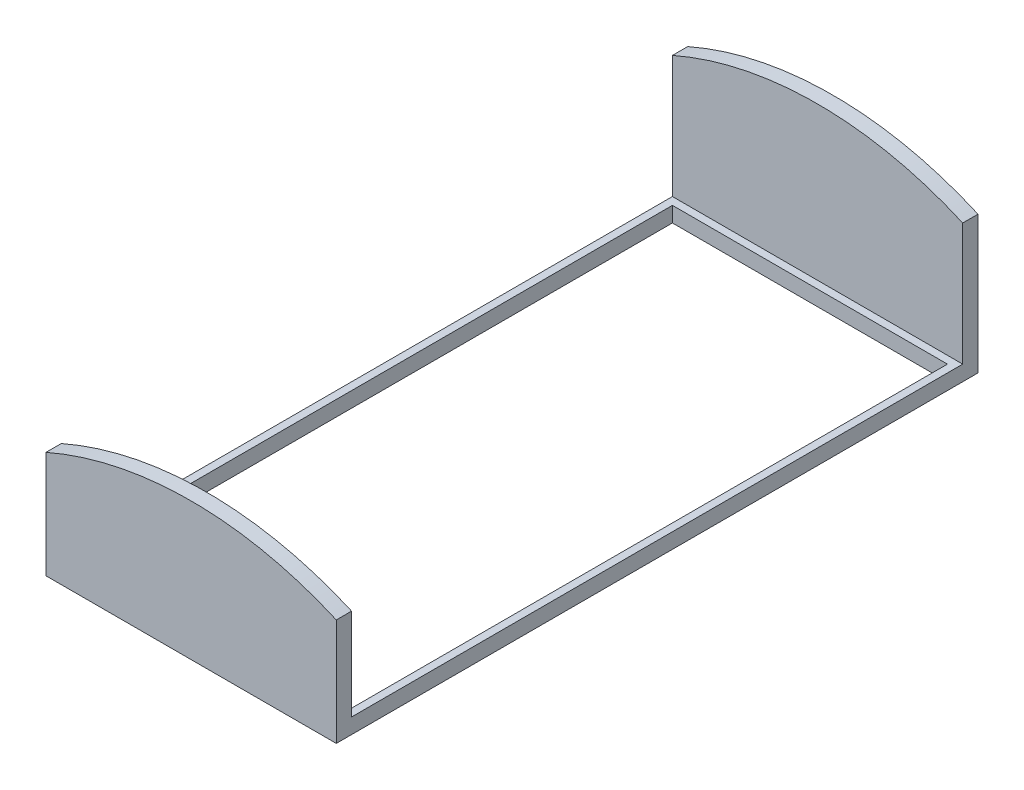
ISO-10303-21;
HEADER;
FILE_DESCRIPTION(('STEP AP214'),'2;1');
FILE_NAME('part.step','',(''),(''),'','','');
FILE_SCHEMA(('AUTOMOTIVE_DESIGN { 1 0 10303 214 1 1 1 1 }'));
ENDSEC;
DATA;
#1=APPLICATION_CONTEXT('core data for automotive mechanical design processes');
#2=APPLICATION_PROTOCOL_DEFINITION('international standard','automotive_design',2000,#1);
#3=PRODUCT_CONTEXT('',#1,'mechanical');
#4=PRODUCT('Part','Part','',(#3));
#5=PRODUCT_RELATED_PRODUCT_CATEGORY('part','',(#4));
#6=PRODUCT_DEFINITION_FORMATION('','',#4);
#7=PRODUCT_DEFINITION_CONTEXT('part definition',#1,'design');
#8=PRODUCT_DEFINITION('design','',#6,#7);
#9=PRODUCT_DEFINITION_SHAPE('','',#8);
#10=(LENGTH_UNIT() NAMED_UNIT(*) SI_UNIT(.MILLI.,.METRE.));
#11=(NAMED_UNIT(*) PLANE_ANGLE_UNIT() SI_UNIT($,.RADIAN.));
#12=(NAMED_UNIT(*) SI_UNIT($,.STERADIAN.) SOLID_ANGLE_UNIT());
#13=UNCERTAINTY_MEASURE_WITH_UNIT(LENGTH_MEASURE(1.E-05),#10,'distance_accuracy_value','');
#14=(GEOMETRIC_REPRESENTATION_CONTEXT(3) GLOBAL_UNCERTAINTY_ASSIGNED_CONTEXT((#13)) GLOBAL_UNIT_ASSIGNED_CONTEXT((#10,
#11,#12)) REPRESENTATION_CONTEXT('',''));
#15=CARTESIAN_POINT('',(0.,0.,0.));
#16=DIRECTION('',(0.,0.,1.));
#17=DIRECTION('',(1.,0.,0.));
#18=AXIS2_PLACEMENT_3D('',#15,#16,#17);
#19=CARTESIAN_POINT('',(0.,50.,0.));
#20=DIRECTION('',(0.,-1.,0.));
#21=DIRECTION('',(0.,0.,-1.));
#22=AXIS2_PLACEMENT_3D('',#19,#20,#21);
#23=PLANE('',#22);
#24=DIRECTION('',(0.,0.,-1.));
#25=VECTOR('',#24,1.);
#26=CARTESIAN_POINT('',(450.,50.,975.));
#27=LINE('',#26,#25);
#28=CARTESIAN_POINT('',(450.,50.,975.));
#29=VERTEX_POINT('',#28);
#30=CARTESIAN_POINT('',(450.,50.,-975.));
#31=VERTEX_POINT('',#30);
#32=EDGE_CURVE('E189',#29,#31,#27,.T.);
#33=ORIENTED_EDGE('',*,*,#32,.F.);
#34=DIRECTION('',(1.,0.,0.));
#35=VECTOR('',#34,1.);
#36=CARTESIAN_POINT('',(-450.,50.,975.));
#37=LINE('',#36,#35);
#38=CARTESIAN_POINT('',(-450.,50.,975.));
#39=VERTEX_POINT('',#38);
#40=EDGE_CURVE('E196',#39,#29,#37,.T.);
#41=ORIENTED_EDGE('',*,*,#40,.F.);
#42=DIRECTION('',(0.,0.,1.));
#43=VECTOR('',#42,1.);
#44=CARTESIAN_POINT('',(-450.,50.,975.));
#45=LINE('',#44,#43);
#46=CARTESIAN_POINT('',(-450.,50.,-975.));
#47=VERTEX_POINT('',#46);
#48=EDGE_CURVE('E194',#47,#39,#45,.T.);
#49=ORIENTED_EDGE('',*,*,#48,.F.);
#50=DIRECTION('',(-1.,0.,0.));
#51=VECTOR('',#50,1.);
#52=CARTESIAN_POINT('',(-450.,50.,-975.));
#53=LINE('',#52,#51);
#54=EDGE_CURVE('E191',#31,#47,#53,.T.);
#55=ORIENTED_EDGE('',*,*,#54,.F.);
#56=EDGE_LOOP('',(#33,#41,#49,#55));
#57=FACE_BOUND('',#56,.T.);
#58=DIRECTION('',(-1.,0.,0.));
#59=VECTOR('',#58,1.);
#60=CARTESIAN_POINT('',(-475.,50.,1000.));
#61=LINE('',#60,#59);
#62=CARTESIAN_POINT('',(475.,50.,1000.));
#63=VERTEX_POINT('',#62);
#64=CARTESIAN_POINT('',(-475.,50.,1000.));
#65=VERTEX_POINT('',#64);
#66=EDGE_CURVE('E150',#63,#65,#61,.T.);
#67=ORIENTED_EDGE('',*,*,#66,.F.);
#68=DIRECTION('',(0.,0.,-1.));
#69=VECTOR('',#68,1.);
#70=CARTESIAN_POINT('',(475.,50.,1000.));
#71=LINE('',#70,#69);
#72=CARTESIAN_POINT('',(475.,50.,-1000.));
#73=VERTEX_POINT('',#72);
#74=EDGE_CURVE('E41',#63,#73,#71,.T.);
#75=ORIENTED_EDGE('',*,*,#74,.T.);
#76=DIRECTION('',(1.,0.,0.));
#77=VECTOR('',#76,1.);
#78=CARTESIAN_POINT('',(-475.,50.,-1000.));
#79=LINE('',#78,#77);
#80=CARTESIAN_POINT('',(-475.,50.,-1000.));
#81=VERTEX_POINT('',#80);
#82=EDGE_CURVE('E48',#81,#73,#79,.T.);
#83=ORIENTED_EDGE('',*,*,#82,.F.);
#84=DIRECTION('',(0.,0.,1.));
#85=VECTOR('',#84,1.);
#86=CARTESIAN_POINT('',(-475.,50.,1000.));
#87=LINE('',#86,#85);
#88=EDGE_CURVE('E11',#81,#65,#87,.T.);
#89=ORIENTED_EDGE('',*,*,#88,.T.);
#90=EDGE_LOOP('',(#67,#75,#83,#89));
#91=FACE_BOUND('',#90,.T.);
#92=ADVANCED_FACE('F32',(#57,#91),#23,.F.);
#93=CARTESIAN_POINT('',(0.,0.,0.));
#94=DIRECTION('',(0.,-1.,0.));
#95=DIRECTION('',(0.,0.,-1.));
#96=AXIS2_PLACEMENT_3D('',#93,#94,#95);
#97=PLANE('',#96);
#98=DIRECTION('',(0.,0.,-1.));
#99=VECTOR('',#98,1.);
#100=CARTESIAN_POINT('',(475.,0.,1000.));
#101=LINE('',#100,#99);
#102=CARTESIAN_POINT('',(475.,0.,1050.));
#103=VERTEX_POINT('',#102);
#104=CARTESIAN_POINT('',(475.,0.,-1050.));
#105=VERTEX_POINT('',#104);
#106=EDGE_CURVE('E217',#103,#105,#101,.T.);
#107=ORIENTED_EDGE('',*,*,#106,.F.);
#108=DIRECTION('',(1.,0.,0.));
#109=VECTOR('',#108,1.);
#110=CARTESIAN_POINT('',(-475.,0.,1050.));
#111=LINE('',#110,#109);
#112=CARTESIAN_POINT('',(-475.,0.,1050.));
#113=VERTEX_POINT('',#112);
#114=EDGE_CURVE('E142',#113,#103,#111,.T.);
#115=ORIENTED_EDGE('',*,*,#114,.F.);
#116=DIRECTION('',(0.,0.,1.));
#117=VECTOR('',#116,1.);
#118=CARTESIAN_POINT('',(-475.,0.,1000.));
#119=LINE('',#118,#117);
#120=CARTESIAN_POINT('',(-475.,0.,-1050.));
#121=VERTEX_POINT('',#120);
#122=EDGE_CURVE('E36',#121,#113,#119,.T.);
#123=ORIENTED_EDGE('',*,*,#122,.F.);
#124=DIRECTION('',(-1.,0.,0.));
#125=VECTOR('',#124,1.);
#126=CARTESIAN_POINT('',(475.,0.,-1050.));
#127=LINE('',#126,#125);
#128=EDGE_CURVE('E182',#105,#121,#127,.T.);
#129=ORIENTED_EDGE('',*,*,#128,.F.);
#130=EDGE_LOOP('',(#107,#115,#123,#129));
#131=FACE_BOUND('',#130,.T.);
#132=DIRECTION('',(1.,0.,0.));
#133=VECTOR('',#132,1.);
#134=CARTESIAN_POINT('',(-450.,0.,975.));
#135=LINE('',#134,#133);
#136=CARTESIAN_POINT('',(-450.,0.,975.));
#137=VERTEX_POINT('',#136);
#138=CARTESIAN_POINT('',(450.,0.,975.));
#139=VERTEX_POINT('',#138);
#140=EDGE_CURVE('E192',#137,#139,#135,.T.);
#141=ORIENTED_EDGE('',*,*,#140,.T.);
#142=DIRECTION('',(0.,0.,-1.));
#143=VECTOR('',#142,1.);
#144=CARTESIAN_POINT('',(450.,0.,975.));
#145=LINE('',#144,#143);
#146=CARTESIAN_POINT('',(450.,0.,-975.));
#147=VERTEX_POINT('',#146);
#148=EDGE_CURVE('E188',#139,#147,#145,.T.);
#149=ORIENTED_EDGE('',*,*,#148,.T.);
#150=DIRECTION('',(-1.,0.,0.));
#151=VECTOR('',#150,1.);
#152=CARTESIAN_POINT('',(-450.,0.,-975.));
#153=LINE('',#152,#151);
#154=CARTESIAN_POINT('',(-450.,0.,-975.));
#155=VERTEX_POINT('',#154);
#156=EDGE_CURVE('E201',#147,#155,#153,.T.);
#157=ORIENTED_EDGE('',*,*,#156,.T.);
#158=DIRECTION('',(0.,0.,1.));
#159=VECTOR('',#158,1.);
#160=CARTESIAN_POINT('',(-450.,0.,975.));
#161=LINE('',#160,#159);
#162=EDGE_CURVE('E204',#155,#137,#161,.T.);
#163=ORIENTED_EDGE('',*,*,#162,.T.);
#164=EDGE_LOOP('',(#141,#149,#157,#163));
#165=FACE_BOUND('',#164,.T.);
#166=ADVANCED_FACE('F223',(#131,#165),#97,.T.);
#167=CARTESIAN_POINT('',(475.,50.,1000.));
#168=DIRECTION('',(-1.,0.,0.));
#169=DIRECTION('',(0.,0.,1.));
#170=AXIS2_PLACEMENT_3D('',#167,#168,#169);
#171=PLANE('',#170);
#172=ORIENTED_EDGE('',*,*,#106,.T.);
#173=DIRECTION('',(0.,-1.,0.));
#174=VECTOR('',#173,1.);
#175=CARTESIAN_POINT('',(475.,0.,-1050.));
#176=LINE('',#175,#174);
#177=CARTESIAN_POINT('',(475.,450.,-1050.));
#178=VERTEX_POINT('',#177);
#179=EDGE_CURVE('E143',#178,#105,#176,.T.);
#180=ORIENTED_EDGE('',*,*,#179,.F.);
#181=DIRECTION('',(0.,0.,-1.));
#182=VECTOR('',#181,1.);
#183=CARTESIAN_POINT('',(475.,450.,-1050.));
#184=LINE('',#183,#182);
#185=CARTESIAN_POINT('',(475.,450.,-1000.));
#186=VERTEX_POINT('',#185);
#187=EDGE_CURVE('E167',#186,#178,#184,.T.);
#188=ORIENTED_EDGE('',*,*,#187,.F.);
#189=DIRECTION('',(0.,-1.,0.));
#190=VECTOR('',#189,1.);
#191=CARTESIAN_POINT('',(475.,450.,-1000.));
#192=LINE('',#191,#190);
#193=EDGE_CURVE('E170',#186,#73,#192,.T.);
#194=ORIENTED_EDGE('',*,*,#193,.T.);
#195=ORIENTED_EDGE('',*,*,#74,.F.);
#196=DIRECTION('',(0.,-1.,0.));
#197=VECTOR('',#196,1.);
#198=CARTESIAN_POINT('',(475.,350.,1000.));
#199=LINE('',#198,#197);
#200=CARTESIAN_POINT('',(475.,350.,1000.));
#201=VERTEX_POINT('',#200);
#202=EDGE_CURVE('E127',#201,#63,#199,.T.);
#203=ORIENTED_EDGE('',*,*,#202,.F.);
#204=DIRECTION('',(0.,0.,-1.));
#205=VECTOR('',#204,1.);
#206=CARTESIAN_POINT('',(475.,350.,1050.));
#207=LINE('',#206,#205);
#208=CARTESIAN_POINT('',(475.,350.,1050.));
#209=VERTEX_POINT('',#208);
#210=EDGE_CURVE('E123',#209,#201,#207,.T.);
#211=ORIENTED_EDGE('',*,*,#210,.F.);
#212=DIRECTION('',(0.,1.,0.));
#213=VECTOR('',#212,1.);
#214=CARTESIAN_POINT('',(475.,0.,1050.));
#215=LINE('',#214,#213);
#216=EDGE_CURVE('E125',#103,#209,#215,.T.);
#217=ORIENTED_EDGE('',*,*,#216,.F.);
#218=EDGE_LOOP('',(#172,#180,#188,#194,#195,#203,#211,#217));
#219=FACE_BOUND('',#218,.T.);
#220=ADVANCED_FACE('F34',(#219),#171,.F.);
#221=CARTESIAN_POINT('',(-475.,50.,1000.));
#222=DIRECTION('',(1.,0.,0.));
#223=DIRECTION('',(0.,0.,-1.));
#224=AXIS2_PLACEMENT_3D('',#221,#222,#223);
#225=PLANE('',#224);
#226=ORIENTED_EDGE('',*,*,#122,.T.);
#227=DIRECTION('',(0.,-1.,0.));
#228=VECTOR('',#227,1.);
#229=CARTESIAN_POINT('',(-475.,0.,1050.));
#230=LINE('',#229,#228);
#231=CARTESIAN_POINT('',(-475.,350.,1050.));
#232=VERTEX_POINT('',#231);
#233=EDGE_CURVE('E177',#232,#113,#230,.T.);
#234=ORIENTED_EDGE('',*,*,#233,.F.);
#235=DIRECTION('',(0.,0.,1.));
#236=VECTOR('',#235,1.);
#237=CARTESIAN_POINT('',(-475.,350.,1050.));
#238=LINE('',#237,#236);
#239=CARTESIAN_POINT('',(-475.,350.,1000.));
#240=VERTEX_POINT('',#239);
#241=EDGE_CURVE('E133',#240,#232,#238,.T.);
#242=ORIENTED_EDGE('',*,*,#241,.F.);
#243=DIRECTION('',(0.,-1.,0.));
#244=VECTOR('',#243,1.);
#245=CARTESIAN_POINT('',(-475.,350.,1000.));
#246=LINE('',#245,#244);
#247=EDGE_CURVE('E132',#240,#65,#246,.T.);
#248=ORIENTED_EDGE('',*,*,#247,.T.);
#249=ORIENTED_EDGE('',*,*,#88,.F.);
#250=DIRECTION('',(0.,-1.,0.));
#251=VECTOR('',#250,1.);
#252=CARTESIAN_POINT('',(-475.,450.,-1000.));
#253=LINE('',#252,#251);
#254=CARTESIAN_POINT('',(-475.,450.,-1000.));
#255=VERTEX_POINT('',#254);
#256=EDGE_CURVE('E174',#255,#81,#253,.T.);
#257=ORIENTED_EDGE('',*,*,#256,.F.);
#258=DIRECTION('',(0.,0.,1.));
#259=VECTOR('',#258,1.);
#260=CARTESIAN_POINT('',(-475.,450.,-1050.));
#261=LINE('',#260,#259);
#262=CARTESIAN_POINT('',(-475.,450.,-1050.));
#263=VERTEX_POINT('',#262);
#264=EDGE_CURVE('E164',#263,#255,#261,.T.);
#265=ORIENTED_EDGE('',*,*,#264,.F.);
#266=DIRECTION('',(0.,1.,0.));
#267=VECTOR('',#266,1.);
#268=CARTESIAN_POINT('',(-475.,0.,-1050.));
#269=LINE('',#268,#267);
#270=EDGE_CURVE('E185',#121,#263,#269,.T.);
#271=ORIENTED_EDGE('',*,*,#270,.F.);
#272=EDGE_LOOP('',(#226,#234,#242,#248,#249,#257,#265,#271));
#273=FACE_BOUND('',#272,.T.);
#274=ADVANCED_FACE('F221',(#273),#225,.F.);
#275=CARTESIAN_POINT('',(450.,50.,975.));
#276=DIRECTION('',(-1.,0.,0.));
#277=DIRECTION('',(0.,0.,1.));
#278=AXIS2_PLACEMENT_3D('',#275,#276,#277);
#279=PLANE('',#278);
#280=ORIENTED_EDGE('',*,*,#148,.F.);
#281=DIRECTION('',(0.,-1.,0.));
#282=VECTOR('',#281,1.);
#283=CARTESIAN_POINT('',(450.,50.,975.));
#284=LINE('',#283,#282);
#285=EDGE_CURVE('E198',#29,#139,#284,.T.);
#286=ORIENTED_EDGE('',*,*,#285,.F.);
#287=ORIENTED_EDGE('',*,*,#32,.T.);
#288=DIRECTION('',(0.,-1.,0.));
#289=VECTOR('',#288,1.);
#290=CARTESIAN_POINT('',(450.,50.,-975.));
#291=LINE('',#290,#289);
#292=EDGE_CURVE('E214',#31,#147,#291,.T.);
#293=ORIENTED_EDGE('',*,*,#292,.T.);
#294=EDGE_LOOP('',(#280,#286,#287,#293));
#295=FACE_BOUND('',#294,.T.);
#296=ADVANCED_FACE('F254',(#295),#279,.T.);
#297=CARTESIAN_POINT('',(-450.,50.,-975.));
#298=DIRECTION('',(0.,0.,1.));
#299=DIRECTION('',(1.,0.,0.));
#300=AXIS2_PLACEMENT_3D('',#297,#298,#299);
#301=PLANE('',#300);
#302=ORIENTED_EDGE('',*,*,#156,.F.);
#303=ORIENTED_EDGE('',*,*,#292,.F.);
#304=ORIENTED_EDGE('',*,*,#54,.T.);
#305=DIRECTION('',(0.,-1.,0.));
#306=VECTOR('',#305,1.);
#307=CARTESIAN_POINT('',(-450.,50.,-975.));
#308=LINE('',#307,#306);
#309=EDGE_CURVE('E212',#47,#155,#308,.T.);
#310=ORIENTED_EDGE('',*,*,#309,.T.);
#311=EDGE_LOOP('',(#302,#303,#304,#310));
#312=FACE_BOUND('',#311,.T.);
#313=ADVANCED_FACE('F261',(#312),#301,.T.);
#314=CARTESIAN_POINT('',(-450.,50.,975.));
#315=DIRECTION('',(1.,0.,0.));
#316=DIRECTION('',(0.,0.,-1.));
#317=AXIS2_PLACEMENT_3D('',#314,#315,#316);
#318=PLANE('',#317);
#319=ORIENTED_EDGE('',*,*,#162,.F.);
#320=ORIENTED_EDGE('',*,*,#309,.F.);
#321=ORIENTED_EDGE('',*,*,#48,.T.);
#322=DIRECTION('',(0.,-1.,0.));
#323=VECTOR('',#322,1.);
#324=CARTESIAN_POINT('',(-450.,50.,975.));
#325=LINE('',#324,#323);
#326=EDGE_CURVE('E56',#39,#137,#325,.T.);
#327=ORIENTED_EDGE('',*,*,#326,.T.);
#328=EDGE_LOOP('',(#319,#320,#321,#327));
#329=FACE_BOUND('',#328,.T.);
#330=ADVANCED_FACE('F376',(#329),#318,.T.);
#331=CARTESIAN_POINT('',(-450.,50.,975.));
#332=DIRECTION('',(0.,0.,-1.));
#333=DIRECTION('',(-1.,0.,0.));
#334=AXIS2_PLACEMENT_3D('',#331,#332,#333);
#335=PLANE('',#334);
#336=ORIENTED_EDGE('',*,*,#140,.F.);
#337=ORIENTED_EDGE('',*,*,#326,.F.);
#338=ORIENTED_EDGE('',*,*,#40,.T.);
#339=ORIENTED_EDGE('',*,*,#285,.T.);
#340=EDGE_LOOP('',(#336,#337,#338,#339));
#341=FACE_BOUND('',#340,.T.);
#342=ADVANCED_FACE('F278',(#341),#335,.T.);
#343=CARTESIAN_POINT('',(0.,0.,-1050.));
#344=DIRECTION('',(0.,0.,1.));
#345=DIRECTION('',(1.,0.,0.));
#346=AXIS2_PLACEMENT_3D('',#343,#344,#345);
#347=PLANE('',#346);
#348=ORIENTED_EDGE('',*,*,#179,.T.);
#349=ORIENTED_EDGE('',*,*,#128,.T.);
#350=ORIENTED_EDGE('',*,*,#270,.T.);
#351=CARTESIAN_POINT('',(1.11022302462516E-13,-627.919046164588,-1050.));
#352=DIRECTION('',(0.,0.,-1.));
#353=DIRECTION('',(1.,0.,0.));
#354=AXIS2_PLACEMENT_3D('',#351,#352,#353);
#355=CIRCLE('',#354,1177.93653058404);
#356=EDGE_CURVE('E158',#263,#178,#355,.T.);
#357=ORIENTED_EDGE('',*,*,#356,.T.);
#358=EDGE_LOOP('',(#348,#349,#350,#357));
#359=FACE_BOUND('',#358,.T.);
#360=ADVANCED_FACE('F226',(#359),#347,.F.);
#361=CARTESIAN_POINT('',(0.,0.,1050.));
#362=DIRECTION('',(0.,0.,-1.));
#363=DIRECTION('',(-1.,0.,0.));
#364=AXIS2_PLACEMENT_3D('',#361,#362,#363);
#365=PLANE('',#364);
#366=ORIENTED_EDGE('',*,*,#233,.T.);
#367=ORIENTED_EDGE('',*,*,#114,.T.);
#368=ORIENTED_EDGE('',*,*,#216,.T.);
#369=CARTESIAN_POINT('',(1.11022302462516E-13,-728.625738355314,1050.));
#370=DIRECTION('',(0.,0.,1.));
#371=DIRECTION('',(-1.,0.,0.));
#372=AXIS2_PLACEMENT_3D('',#369,#370,#371);
#373=CIRCLE('',#372,1178.58325265657);
#374=EDGE_CURVE('E140',#209,#232,#373,.T.);
#375=ORIENTED_EDGE('',*,*,#374,.T.);
#376=EDGE_LOOP('',(#366,#367,#368,#375));
#377=FACE_BOUND('',#376,.T.);
#378=ADVANCED_FACE('F139',(#377),#365,.F.);
#379=CARTESIAN_POINT('',(-475.,450.,-1000.));
#380=DIRECTION('',(0.,0.,-1.));
#381=DIRECTION('',(-1.,0.,0.));
#382=AXIS2_PLACEMENT_3D('',#379,#380,#381);
#383=PLANE('',#382);
#384=ORIENTED_EDGE('',*,*,#82,.T.);
#385=ORIENTED_EDGE('',*,*,#193,.F.);
#386=CARTESIAN_POINT('',(1.11022302462516E-13,-627.919046164588,-1000.));
#387=DIRECTION('',(0.,0.,-1.));
#388=DIRECTION('',(1.,0.,0.));
#389=AXIS2_PLACEMENT_3D('',#386,#387,#388);
#390=CIRCLE('',#389,1177.93653058404);
#391=EDGE_CURVE('E159',#255,#186,#390,.T.);
#392=ORIENTED_EDGE('',*,*,#391,.F.);
#393=ORIENTED_EDGE('',*,*,#256,.T.);
#394=EDGE_LOOP('',(#384,#385,#392,#393));
#395=FACE_BOUND('',#394,.T.);
#396=ADVANCED_FACE('F233',(#395),#383,.F.);
#397=CARTESIAN_POINT('',(1.11022302462516E-13,-627.919046164588,-1000.));
#398=DIRECTION('',(0.,0.,-1.));
#399=DIRECTION('',(-1.,0.,0.));
#400=AXIS2_PLACEMENT_3D('',#397,#398,#399);
#401=CYLINDRICAL_SURFACE('',#400,1177.93653058404);
#402=ORIENTED_EDGE('',*,*,#356,.F.);
#403=ORIENTED_EDGE('',*,*,#264,.T.);
#404=ORIENTED_EDGE('',*,*,#391,.T.);
#405=ORIENTED_EDGE('',*,*,#187,.T.);
#406=EDGE_LOOP('',(#402,#403,#404,#405));
#407=FACE_BOUND('',#406,.T.);
#408=ADVANCED_FACE('F230',(#407),#401,.T.);
#409=CARTESIAN_POINT('',(-475.,350.,1000.));
#410=DIRECTION('',(0.,0.,1.));
#411=DIRECTION('',(1.,0.,0.));
#412=AXIS2_PLACEMENT_3D('',#409,#410,#411);
#413=PLANE('',#412);
#414=ORIENTED_EDGE('',*,*,#66,.T.);
#415=ORIENTED_EDGE('',*,*,#247,.F.);
#416=CARTESIAN_POINT('',(1.11022302462516E-13,-728.625738355314,1000.));
#417=DIRECTION('',(0.,0.,1.));
#418=DIRECTION('',(-1.,0.,0.));
#419=AXIS2_PLACEMENT_3D('',#416,#417,#418);
#420=CIRCLE('',#419,1178.58325265657);
#421=EDGE_CURVE('E148',#201,#240,#420,.T.);
#422=ORIENTED_EDGE('',*,*,#421,.F.);
#423=ORIENTED_EDGE('',*,*,#202,.T.);
#424=EDGE_LOOP('',(#414,#415,#422,#423));
#425=FACE_BOUND('',#424,.T.);
#426=ADVANCED_FACE('F236',(#425),#413,.F.);
#427=CARTESIAN_POINT('',(1.11022302462516E-13,-728.625738355314,1000.));
#428=DIRECTION('',(0.,0.,1.));
#429=DIRECTION('',(1.,0.,0.));
#430=AXIS2_PLACEMENT_3D('',#427,#428,#429);
#431=CYLINDRICAL_SURFACE('',#430,1178.58325265657);
#432=ORIENTED_EDGE('',*,*,#374,.F.);
#433=ORIENTED_EDGE('',*,*,#210,.T.);
#434=ORIENTED_EDGE('',*,*,#421,.T.);
#435=ORIENTED_EDGE('',*,*,#241,.T.);
#436=EDGE_LOOP('',(#432,#433,#434,#435));
#437=FACE_BOUND('',#436,.T.);
#438=ADVANCED_FACE('F146',(#437),#431,.T.);
#439=CLOSED_SHELL('',(#92,#166,#220,#274,#296,#313,#330,#342,#360,#378,#396,#408,#426,#438));
#440=MANIFOLD_SOLID_BREP('B2',#439);
#441=ADVANCED_BREP_SHAPE_REPRESENTATION('',(#18,#440),#14);
#442=SHAPE_DEFINITION_REPRESENTATION(#9,#441);
ENDSEC;
END-ISO-10303-21;
